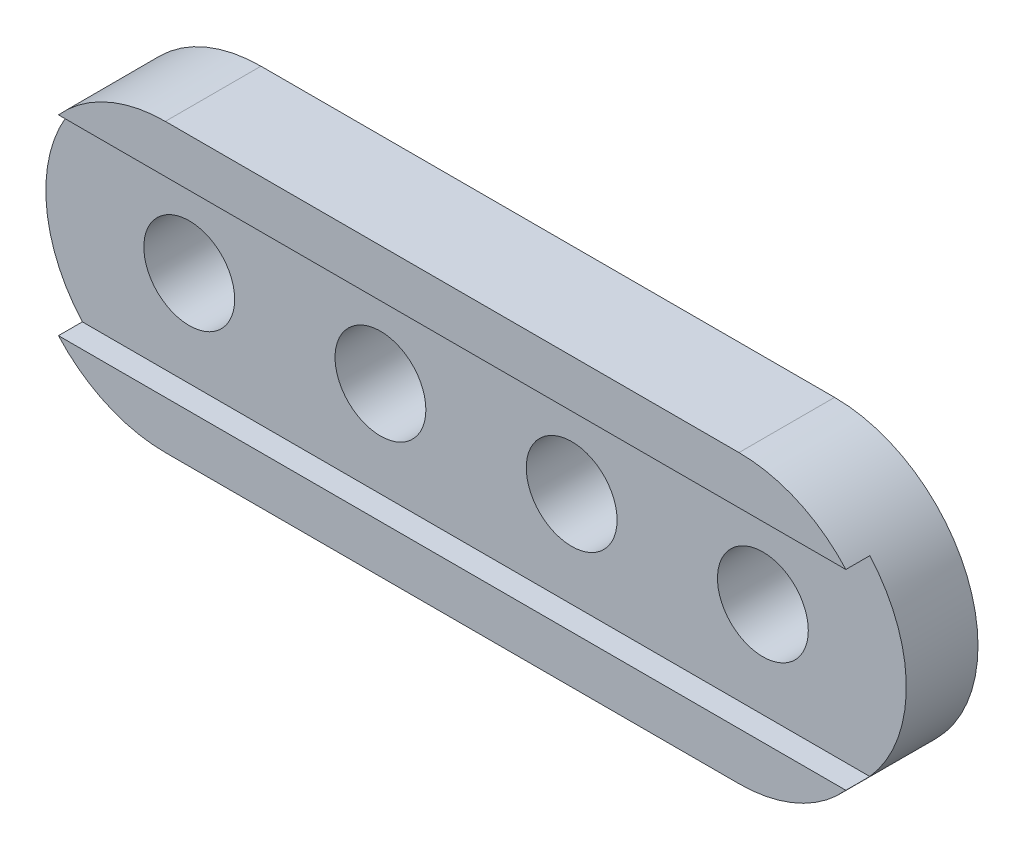
ISO-10303-21;
HEADER;
FILE_DESCRIPTION(('STEP AP214'),'2;1');
FILE_NAME('part.step','',(''),(''),'','','');
FILE_SCHEMA(('AUTOMOTIVE_DESIGN { 1 0 10303 214 1 1 1 1 }'));
ENDSEC;
DATA;
#1=APPLICATION_CONTEXT('core data for automotive mechanical design processes');
#2=APPLICATION_PROTOCOL_DEFINITION('international standard','automotive_design',2000,#1);
#3=PRODUCT_CONTEXT('',#1,'mechanical');
#4=PRODUCT('Part','Part','',(#3));
#5=PRODUCT_RELATED_PRODUCT_CATEGORY('part','',(#4));
#6=PRODUCT_DEFINITION_FORMATION('','',#4);
#7=PRODUCT_DEFINITION_CONTEXT('part definition',#1,'design');
#8=PRODUCT_DEFINITION('design','',#6,#7);
#9=PRODUCT_DEFINITION_SHAPE('','',#8);
#10=(LENGTH_UNIT() NAMED_UNIT(*) SI_UNIT(.MILLI.,.METRE.));
#11=(NAMED_UNIT(*) PLANE_ANGLE_UNIT() SI_UNIT($,.RADIAN.));
#12=(NAMED_UNIT(*) SI_UNIT($,.STERADIAN.) SOLID_ANGLE_UNIT());
#13=UNCERTAINTY_MEASURE_WITH_UNIT(LENGTH_MEASURE(1.E-05),#10,'distance_accuracy_value','');
#14=(GEOMETRIC_REPRESENTATION_CONTEXT(3) GLOBAL_UNCERTAINTY_ASSIGNED_CONTEXT((#13)) GLOBAL_UNIT_ASSIGNED_CONTEXT((#10,
#11,#12)) REPRESENTATION_CONTEXT('',''));
#15=CARTESIAN_POINT('',(0.,0.,0.));
#16=DIRECTION('',(0.,0.,1.));
#17=DIRECTION('',(1.,0.,0.));
#18=AXIS2_PLACEMENT_3D('',#15,#16,#17);
#19=CARTESIAN_POINT('',(4.,0.,0.));
#20=DIRECTION('',(0.,0.,1.));
#21=DIRECTION('',(1.,0.,0.));
#22=AXIS2_PLACEMENT_3D('',#19,#20,#21);
#23=CYLINDRICAL_SURFACE('',#22,1.9);
#24=CARTESIAN_POINT('',(4.,0.,0.));
#25=DIRECTION('',(0.,0.,1.));
#26=DIRECTION('',(1.,0.,0.));
#27=AXIS2_PLACEMENT_3D('',#24,#25,#26);
#28=CIRCLE('',#27,1.9);
#29=CARTESIAN_POINT('',(5.9,0.,0.));
#30=VERTEX_POINT('',#29);
#31=EDGE_CURVE('E47',#30,#30,#28,.T.);
#32=ORIENTED_EDGE('',*,*,#31,.F.);
#33=EDGE_LOOP('',(#32));
#34=FACE_BOUND('',#33,.T.);
#35=CARTESIAN_POINT('',(4.,0.,3.));
#36=DIRECTION('',(0.,0.,1.));
#37=DIRECTION('',(1.,0.,0.));
#38=AXIS2_PLACEMENT_3D('',#35,#36,#37);
#39=CIRCLE('',#38,1.9);
#40=CARTESIAN_POINT('',(5.9,0.,3.));
#41=VERTEX_POINT('',#40);
#42=EDGE_CURVE('E11',#41,#41,#39,.T.);
#43=ORIENTED_EDGE('',*,*,#42,.T.);
#44=EDGE_LOOP('',(#43));
#45=FACE_BOUND('',#44,.T.);
#46=ADVANCED_FACE('F39',(#34,#45),#23,.F.);
#47=CARTESIAN_POINT('',(-12.,0.,4.));
#48=DIRECTION('',(0.,0.,1.));
#49=DIRECTION('',(1.,0.,0.));
#50=AXIS2_PLACEMENT_3D('',#47,#48,#49);
#51=PLANE('',#50);
#52=DIRECTION('',(-1.,0.,0.));
#53=VECTOR('',#52,1.);
#54=CARTESIAN_POINT('',(-12.,4.,4.));
#55=LINE('',#54,#53);
#56=CARTESIAN_POINT('',(16.4721359549996,4.,4.));
#57=VERTEX_POINT('',#56);
#58=CARTESIAN_POINT('',(-16.4721359549996,4.,4.));
#59=VERTEX_POINT('',#58);
#60=EDGE_CURVE('E119',#57,#59,#55,.T.);
#61=ORIENTED_EDGE('',*,*,#60,.F.);
#62=CARTESIAN_POINT('',(12.,0.,4.));
#63=DIRECTION('',(0.,0.,1.));
#64=DIRECTION('',(1.,0.,0.));
#65=AXIS2_PLACEMENT_3D('',#62,#63,#64);
#66=CIRCLE('',#65,6.);
#67=CARTESIAN_POINT('',(12.,6.,4.));
#68=VERTEX_POINT('',#67);
#69=EDGE_CURVE('E138',#57,#68,#66,.T.);
#70=ORIENTED_EDGE('',*,*,#69,.T.);
#71=DIRECTION('',(-1.,0.,0.));
#72=VECTOR('',#71,1.);
#73=CARTESIAN_POINT('',(-12.,6.,4.));
#74=LINE('',#73,#72);
#75=CARTESIAN_POINT('',(-12.,6.,4.));
#76=VERTEX_POINT('',#75);
#77=EDGE_CURVE('E63',#68,#76,#74,.T.);
#78=ORIENTED_EDGE('',*,*,#77,.T.);
#79=CARTESIAN_POINT('',(-12.,0.,4.));
#80=DIRECTION('',(0.,0.,1.));
#81=DIRECTION('',(1.,0.,0.));
#82=AXIS2_PLACEMENT_3D('',#79,#80,#81);
#83=CIRCLE('',#82,6.);
#84=EDGE_CURVE('E234',#76,#59,#83,.T.);
#85=ORIENTED_EDGE('',*,*,#84,.T.);
#86=EDGE_LOOP('',(#61,#70,#78,#85));
#87=FACE_BOUND('',#86,.T.);
#88=ADVANCED_FACE('F182',(#87),#51,.T.);
#89=CARTESIAN_POINT('',(-12.,0.,4.));
#90=DIRECTION('',(0.,0.,-1.));
#91=DIRECTION('',(-1.,0.,0.));
#92=AXIS2_PLACEMENT_3D('',#89,#90,#91);
#93=CYLINDRICAL_SURFACE('',#92,6.);
#94=CARTESIAN_POINT('',(-12.,0.,3.));
#95=DIRECTION('',(0.,0.,1.));
#96=DIRECTION('',(1.,0.,0.));
#97=AXIS2_PLACEMENT_3D('',#94,#95,#96);
#98=CIRCLE('',#97,6.);
#99=CARTESIAN_POINT('',(-16.4721359549996,4.,3.));
#100=VERTEX_POINT('',#99);
#101=CARTESIAN_POINT('',(-16.4721359549996,-4.,3.));
#102=VERTEX_POINT('',#101);
#103=EDGE_CURVE('E152',#100,#102,#98,.T.);
#104=ORIENTED_EDGE('',*,*,#103,.F.);
#105=DIRECTION('',(0.,0.,-1.));
#106=VECTOR('',#105,1.);
#107=CARTESIAN_POINT('',(-16.4721359549996,4.,4.));
#108=LINE('',#107,#106);
#109=EDGE_CURVE('E225',#100,#59,#108,.F.);
#110=ORIENTED_EDGE('',*,*,#109,.T.);
#111=ORIENTED_EDGE('',*,*,#84,.F.);
#112=DIRECTION('',(0.,0.,-1.));
#113=VECTOR('',#112,1.);
#114=CARTESIAN_POINT('',(-12.,6.,4.));
#115=LINE('',#114,#113);
#116=CARTESIAN_POINT('',(-12.,6.,0.));
#117=VERTEX_POINT('',#116);
#118=EDGE_CURVE('E142',#76,#117,#115,.T.);
#119=ORIENTED_EDGE('',*,*,#118,.T.);
#120=CARTESIAN_POINT('',(-12.,0.,0.));
#121=DIRECTION('',(0.,0.,1.));
#122=DIRECTION('',(1.,0.,0.));
#123=AXIS2_PLACEMENT_3D('',#120,#121,#122);
#124=CIRCLE('',#123,6.);
#125=CARTESIAN_POINT('',(-12.,-6.,0.));
#126=VERTEX_POINT('',#125);
#127=EDGE_CURVE('E147',#117,#126,#124,.T.);
#128=ORIENTED_EDGE('',*,*,#127,.T.);
#129=DIRECTION('',(0.,0.,-1.));
#130=VECTOR('',#129,1.);
#131=CARTESIAN_POINT('',(-12.,-6.,4.));
#132=LINE('',#131,#130);
#133=CARTESIAN_POINT('',(-12.,-6.,4.));
#134=VERTEX_POINT('',#133);
#135=EDGE_CURVE('E120',#134,#126,#132,.T.);
#136=ORIENTED_EDGE('',*,*,#135,.F.);
#137=CARTESIAN_POINT('',(-16.4721359549996,-4.,4.));
#138=VERTEX_POINT('',#137);
#139=EDGE_CURVE('E91',#138,#134,#83,.T.);
#140=ORIENTED_EDGE('',*,*,#139,.F.);
#141=DIRECTION('',(0.,0.,-1.));
#142=VECTOR('',#141,1.);
#143=CARTESIAN_POINT('',(-16.4721359549996,-4.,4.));
#144=LINE('',#143,#142);
#145=EDGE_CURVE('E54',#138,#102,#144,.T.);
#146=ORIENTED_EDGE('',*,*,#145,.T.);
#147=EDGE_LOOP('',(#104,#110,#111,#119,#128,#136,#140,#146));
#148=FACE_BOUND('',#147,.T.);
#149=ADVANCED_FACE('F215',(#148),#93,.T.);
#150=CARTESIAN_POINT('',(-12.,-6.,4.));
#151=DIRECTION('',(0.,1.,0.));
#152=DIRECTION('',(-1.,0.,0.));
#153=AXIS2_PLACEMENT_3D('',#150,#151,#152);
#154=PLANE('',#153);
#155=DIRECTION('',(1.,0.,0.));
#156=VECTOR('',#155,1.);
#157=CARTESIAN_POINT('',(-12.,-6.,0.));
#158=LINE('',#157,#156);
#159=CARTESIAN_POINT('',(12.,-6.,0.));
#160=VERTEX_POINT('',#159);
#161=EDGE_CURVE('E151',#126,#160,#158,.T.);
#162=ORIENTED_EDGE('',*,*,#161,.T.);
#163=DIRECTION('',(0.,0.,-1.));
#164=VECTOR('',#163,1.);
#165=CARTESIAN_POINT('',(12.,-6.,4.));
#166=LINE('',#165,#164);
#167=CARTESIAN_POINT('',(12.,-6.,4.));
#168=VERTEX_POINT('',#167);
#169=EDGE_CURVE('E165',#168,#160,#166,.T.);
#170=ORIENTED_EDGE('',*,*,#169,.F.);
#171=DIRECTION('',(1.,0.,0.));
#172=VECTOR('',#171,1.);
#173=CARTESIAN_POINT('',(-12.,-6.,4.));
#174=LINE('',#173,#172);
#175=EDGE_CURVE('E135',#134,#168,#174,.T.);
#176=ORIENTED_EDGE('',*,*,#175,.F.);
#177=ORIENTED_EDGE('',*,*,#135,.T.);
#178=EDGE_LOOP('',(#162,#170,#176,#177));
#179=FACE_BOUND('',#178,.T.);
#180=ADVANCED_FACE('F213',(#179),#154,.F.);
#181=CARTESIAN_POINT('',(12.,0.,4.));
#182=DIRECTION('',(0.,0.,-1.));
#183=DIRECTION('',(-1.,0.,0.));
#184=AXIS2_PLACEMENT_3D('',#181,#182,#183);
#185=CYLINDRICAL_SURFACE('',#184,6.);
#186=ORIENTED_EDGE('',*,*,#69,.F.);
#187=DIRECTION('',(0.,0.,-1.));
#188=VECTOR('',#187,1.);
#189=CARTESIAN_POINT('',(16.4721359549996,4.,4.));
#190=LINE('',#189,#188);
#191=CARTESIAN_POINT('',(16.4721359549996,4.,3.));
#192=VERTEX_POINT('',#191);
#193=EDGE_CURVE('E231',#57,#192,#190,.T.);
#194=ORIENTED_EDGE('',*,*,#193,.T.);
#195=CARTESIAN_POINT('',(12.,0.,3.));
#196=DIRECTION('',(0.,0.,1.));
#197=DIRECTION('',(1.,0.,0.));
#198=AXIS2_PLACEMENT_3D('',#195,#196,#197);
#199=CIRCLE('',#198,6.);
#200=CARTESIAN_POINT('',(16.4721359549996,-4.,3.));
#201=VERTEX_POINT('',#200);
#202=EDGE_CURVE('E130',#201,#192,#199,.T.);
#203=ORIENTED_EDGE('',*,*,#202,.F.);
#204=DIRECTION('',(0.,0.,-1.));
#205=VECTOR('',#204,1.);
#206=CARTESIAN_POINT('',(16.4721359549996,-4.,4.));
#207=LINE('',#206,#205);
#208=CARTESIAN_POINT('',(16.4721359549996,-4.,4.));
#209=VERTEX_POINT('',#208);
#210=EDGE_CURVE('E115',#201,#209,#207,.F.);
#211=ORIENTED_EDGE('',*,*,#210,.T.);
#212=EDGE_CURVE('E128',#168,#209,#66,.T.);
#213=ORIENTED_EDGE('',*,*,#212,.F.);
#214=ORIENTED_EDGE('',*,*,#169,.T.);
#215=CARTESIAN_POINT('',(12.,0.,0.));
#216=DIRECTION('',(0.,0.,1.));
#217=DIRECTION('',(1.,0.,0.));
#218=AXIS2_PLACEMENT_3D('',#215,#216,#217);
#219=CIRCLE('',#218,6.);
#220=CARTESIAN_POINT('',(12.,6.,0.));
#221=VERTEX_POINT('',#220);
#222=EDGE_CURVE('E155',#160,#221,#219,.T.);
#223=ORIENTED_EDGE('',*,*,#222,.T.);
#224=DIRECTION('',(0.,0.,-1.));
#225=VECTOR('',#224,1.);
#226=CARTESIAN_POINT('',(12.,6.,4.));
#227=LINE('',#226,#225);
#228=EDGE_CURVE('E162',#68,#221,#227,.T.);
#229=ORIENTED_EDGE('',*,*,#228,.F.);
#230=EDGE_LOOP('',(#186,#194,#203,#211,#213,#214,#223,#229));
#231=FACE_BOUND('',#230,.T.);
#232=ADVANCED_FACE('F126',(#231),#185,.T.);
#233=CARTESIAN_POINT('',(-12.,6.,4.));
#234=DIRECTION('',(0.,-1.,0.));
#235=DIRECTION('',(1.,0.,0.));
#236=AXIS2_PLACEMENT_3D('',#233,#234,#235);
#237=PLANE('',#236);
#238=DIRECTION('',(-1.,0.,0.));
#239=VECTOR('',#238,1.);
#240=CARTESIAN_POINT('',(-12.,6.,0.));
#241=LINE('',#240,#239);
#242=EDGE_CURVE('E84',#221,#117,#241,.T.);
#243=ORIENTED_EDGE('',*,*,#242,.T.);
#244=ORIENTED_EDGE('',*,*,#118,.F.);
#245=ORIENTED_EDGE('',*,*,#77,.F.);
#246=ORIENTED_EDGE('',*,*,#228,.T.);
#247=EDGE_LOOP('',(#243,#244,#245,#246));
#248=FACE_BOUND('',#247,.T.);
#249=ADVANCED_FACE('F207',(#248),#237,.F.);
#250=DIRECTION('',(1.,0.,0.));
#251=VECTOR('',#250,1.);
#252=CARTESIAN_POINT('',(-12.,-4.,4.));
#253=LINE('',#252,#251);
#254=EDGE_CURVE('E112',#138,#209,#253,.T.);
#255=ORIENTED_EDGE('',*,*,#254,.F.);
#256=ORIENTED_EDGE('',*,*,#139,.T.);
#257=ORIENTED_EDGE('',*,*,#175,.T.);
#258=ORIENTED_EDGE('',*,*,#212,.T.);
#259=EDGE_LOOP('',(#255,#256,#257,#258));
#260=FACE_BOUND('',#259,.T.);
#261=ADVANCED_FACE('F134',(#260),#51,.T.);
#262=CARTESIAN_POINT('',(-12.,0.,0.));
#263=DIRECTION('',(0.,0.,1.));
#264=DIRECTION('',(1.,0.,0.));
#265=AXIS2_PLACEMENT_3D('',#262,#263,#264);
#266=PLANE('',#265);
#267=CARTESIAN_POINT('',(12.,0.,0.));
#268=DIRECTION('',(0.,0.,1.));
#269=DIRECTION('',(1.,0.,0.));
#270=AXIS2_PLACEMENT_3D('',#267,#268,#269);
#271=CIRCLE('',#270,1.9);
#272=CARTESIAN_POINT('',(13.9,0.,0.));
#273=VERTEX_POINT('',#272);
#274=EDGE_CURVE('E270',#273,#273,#271,.T.);
#275=ORIENTED_EDGE('',*,*,#274,.T.);
#276=EDGE_LOOP('',(#275));
#277=FACE_BOUND('',#276,.T.);
#278=CARTESIAN_POINT('',(-4.,0.,0.));
#279=DIRECTION('',(0.,0.,1.));
#280=DIRECTION('',(1.,0.,0.));
#281=AXIS2_PLACEMENT_3D('',#278,#279,#280);
#282=CIRCLE('',#281,1.9);
#283=CARTESIAN_POINT('',(-2.1,0.,0.));
#284=VERTEX_POINT('',#283);
#285=EDGE_CURVE('E266',#284,#284,#282,.T.);
#286=ORIENTED_EDGE('',*,*,#285,.T.);
#287=EDGE_LOOP('',(#286));
#288=FACE_BOUND('',#287,.T.);
#289=CARTESIAN_POINT('',(-12.,0.,0.));
#290=DIRECTION('',(0.,0.,1.));
#291=DIRECTION('',(1.,0.,0.));
#292=AXIS2_PLACEMENT_3D('',#289,#290,#291);
#293=CIRCLE('',#292,1.9);
#294=CARTESIAN_POINT('',(-10.1,0.,0.));
#295=VERTEX_POINT('',#294);
#296=EDGE_CURVE('E254',#295,#295,#293,.T.);
#297=ORIENTED_EDGE('',*,*,#296,.T.);
#298=EDGE_LOOP('',(#297));
#299=FACE_BOUND('',#298,.T.);
#300=ORIENTED_EDGE('',*,*,#127,.F.);
#301=ORIENTED_EDGE('',*,*,#242,.F.);
#302=ORIENTED_EDGE('',*,*,#222,.F.);
#303=ORIENTED_EDGE('',*,*,#161,.F.);
#304=EDGE_LOOP('',(#300,#301,#302,#303));
#305=FACE_BOUND('',#304,.T.);
#306=ORIENTED_EDGE('',*,*,#31,.T.);
#307=EDGE_LOOP('',(#306));
#308=FACE_BOUND('',#307,.T.);
#309=ADVANCED_FACE('F178',(#277,#288,#299,#305,#308),#266,.F.);
#310=CARTESIAN_POINT('',(0.,0.,3.));
#311=DIRECTION('',(0.,0.,1.));
#312=DIRECTION('',(1.,0.,0.));
#313=AXIS2_PLACEMENT_3D('',#310,#311,#312);
#314=PLANE('',#313);
#315=CARTESIAN_POINT('',(12.,0.,3.));
#316=DIRECTION('',(0.,0.,1.));
#317=DIRECTION('',(1.,0.,0.));
#318=AXIS2_PLACEMENT_3D('',#315,#316,#317);
#319=CIRCLE('',#318,1.9);
#320=CARTESIAN_POINT('',(13.9,0.,3.));
#321=VERTEX_POINT('',#320);
#322=EDGE_CURVE('E271',#321,#321,#319,.T.);
#323=ORIENTED_EDGE('',*,*,#322,.F.);
#324=EDGE_LOOP('',(#323));
#325=FACE_BOUND('',#324,.T.);
#326=CARTESIAN_POINT('',(-4.,0.,3.));
#327=DIRECTION('',(0.,0.,1.));
#328=DIRECTION('',(1.,0.,0.));
#329=AXIS2_PLACEMENT_3D('',#326,#327,#328);
#330=CIRCLE('',#329,1.9);
#331=CARTESIAN_POINT('',(-2.1,0.,3.));
#332=VERTEX_POINT('',#331);
#333=EDGE_CURVE('E259',#332,#332,#330,.T.);
#334=ORIENTED_EDGE('',*,*,#333,.F.);
#335=EDGE_LOOP('',(#334));
#336=FACE_BOUND('',#335,.T.);
#337=CARTESIAN_POINT('',(-12.,0.,3.));
#338=DIRECTION('',(0.,0.,1.));
#339=DIRECTION('',(1.,0.,0.));
#340=AXIS2_PLACEMENT_3D('',#337,#338,#339);
#341=CIRCLE('',#340,1.9);
#342=CARTESIAN_POINT('',(-10.1,0.,3.));
#343=VERTEX_POINT('',#342);
#344=EDGE_CURVE('E255',#343,#343,#341,.T.);
#345=ORIENTED_EDGE('',*,*,#344,.F.);
#346=EDGE_LOOP('',(#345));
#347=FACE_BOUND('',#346,.T.);
#348=ORIENTED_EDGE('',*,*,#103,.T.);
#349=DIRECTION('',(1.,0.,0.));
#350=VECTOR('',#349,1.);
#351=CARTESIAN_POINT('',(-18.,-4.,3.));
#352=LINE('',#351,#350);
#353=EDGE_CURVE('E251',#102,#201,#352,.T.);
#354=ORIENTED_EDGE('',*,*,#353,.T.);
#355=ORIENTED_EDGE('',*,*,#202,.T.);
#356=DIRECTION('',(-1.,0.,0.));
#357=VECTOR('',#356,1.);
#358=CARTESIAN_POINT('',(-18.,4.,3.));
#359=LINE('',#358,#357);
#360=EDGE_CURVE('E132',#192,#100,#359,.T.);
#361=ORIENTED_EDGE('',*,*,#360,.T.);
#362=EDGE_LOOP('',(#348,#354,#355,#361));
#363=FACE_BOUND('',#362,.T.);
#364=ORIENTED_EDGE('',*,*,#42,.F.);
#365=EDGE_LOOP('',(#364));
#366=FACE_BOUND('',#365,.T.);
#367=ADVANCED_FACE('F185',(#325,#336,#347,#363,#366),#314,.T.);
#368=CARTESIAN_POINT('',(-18.,4.,3.));
#369=DIRECTION('',(0.,1.,0.));
#370=DIRECTION('',(0.,0.,1.));
#371=AXIS2_PLACEMENT_3D('',#368,#369,#370);
#372=PLANE('',#371);
#373=ORIENTED_EDGE('',*,*,#360,.F.);
#374=ORIENTED_EDGE('',*,*,#193,.F.);
#375=ORIENTED_EDGE('',*,*,#60,.T.);
#376=ORIENTED_EDGE('',*,*,#109,.F.);
#377=EDGE_LOOP('',(#373,#374,#375,#376));
#378=FACE_BOUND('',#377,.T.);
#379=ADVANCED_FACE('F187',(#378),#372,.F.);
#380=CARTESIAN_POINT('',(-18.,-4.,3.));
#381=DIRECTION('',(0.,-1.,0.));
#382=DIRECTION('',(0.,0.,-1.));
#383=AXIS2_PLACEMENT_3D('',#380,#381,#382);
#384=PLANE('',#383);
#385=ORIENTED_EDGE('',*,*,#254,.T.);
#386=ORIENTED_EDGE('',*,*,#210,.F.);
#387=ORIENTED_EDGE('',*,*,#353,.F.);
#388=ORIENTED_EDGE('',*,*,#145,.F.);
#389=EDGE_LOOP('',(#385,#386,#387,#388));
#390=FACE_BOUND('',#389,.T.);
#391=ADVANCED_FACE('F114',(#390),#384,.F.);
#392=CARTESIAN_POINT('',(-12.,0.,0.));
#393=DIRECTION('',(0.,0.,1.));
#394=DIRECTION('',(1.,0.,0.));
#395=AXIS2_PLACEMENT_3D('',#392,#393,#394);
#396=CYLINDRICAL_SURFACE('',#395,1.9);
#397=ORIENTED_EDGE('',*,*,#296,.F.);
#398=EDGE_LOOP('',(#397));
#399=FACE_BOUND('',#398,.T.);
#400=ORIENTED_EDGE('',*,*,#344,.T.);
#401=EDGE_LOOP('',(#400));
#402=FACE_BOUND('',#401,.T.);
#403=ADVANCED_FACE('F201',(#399,#402),#396,.F.);
#404=CARTESIAN_POINT('',(-4.,0.,0.));
#405=DIRECTION('',(0.,0.,1.));
#406=DIRECTION('',(1.,0.,0.));
#407=AXIS2_PLACEMENT_3D('',#404,#405,#406);
#408=CYLINDRICAL_SURFACE('',#407,1.9);
#409=ORIENTED_EDGE('',*,*,#285,.F.);
#410=EDGE_LOOP('',(#409));
#411=FACE_BOUND('',#410,.T.);
#412=ORIENTED_EDGE('',*,*,#333,.T.);
#413=EDGE_LOOP('',(#412));
#414=FACE_BOUND('',#413,.T.);
#415=ADVANCED_FACE('F283',(#411,#414),#408,.F.);
#416=CARTESIAN_POINT('',(12.,0.,0.));
#417=DIRECTION('',(0.,0.,1.));
#418=DIRECTION('',(1.,0.,0.));
#419=AXIS2_PLACEMENT_3D('',#416,#417,#418);
#420=CYLINDRICAL_SURFACE('',#419,1.9);
#421=ORIENTED_EDGE('',*,*,#274,.F.);
#422=EDGE_LOOP('',(#421));
#423=FACE_BOUND('',#422,.T.);
#424=ORIENTED_EDGE('',*,*,#322,.T.);
#425=EDGE_LOOP('',(#424));
#426=FACE_BOUND('',#425,.T.);
#427=ADVANCED_FACE('F280',(#423,#426),#420,.F.);
#428=CLOSED_SHELL('',(#46,#88,#149,#180,#232,#249,#261,#309,#367,#379,#391,#403,#415,#427));
#429=MANIFOLD_SOLID_BREP('B2',#428);
#430=ADVANCED_BREP_SHAPE_REPRESENTATION('',(#18,#429),#14);
#431=SHAPE_DEFINITION_REPRESENTATION(#9,#430);
ENDSEC;
END-ISO-10303-21;
